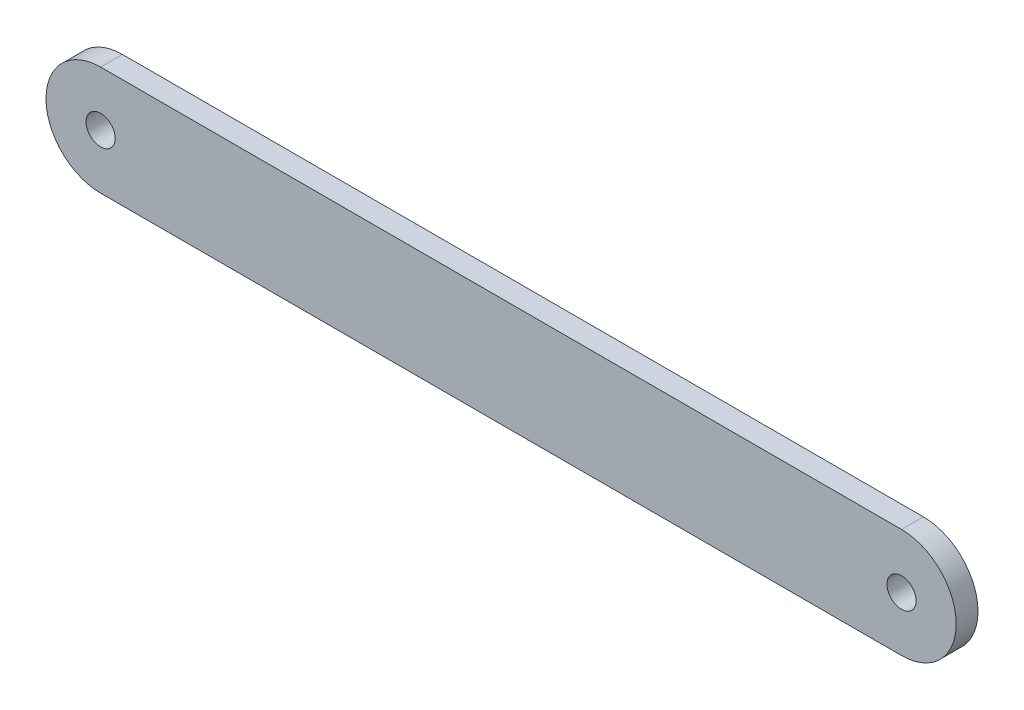
ISO-10303-21;
HEADER;
FILE_DESCRIPTION(('STEP AP214'),'2;1');
FILE_NAME('part.step','',(''),(''),'','','');
FILE_SCHEMA(('AUTOMOTIVE_DESIGN { 1 0 10303 214 1 1 1 1 }'));
ENDSEC;
DATA;
#1=APPLICATION_CONTEXT('core data for automotive mechanical design processes');
#2=APPLICATION_PROTOCOL_DEFINITION('international standard','automotive_design',2000,#1);
#3=PRODUCT_CONTEXT('',#1,'mechanical');
#4=PRODUCT('Part','Part','',(#3));
#5=PRODUCT_RELATED_PRODUCT_CATEGORY('part','',(#4));
#6=PRODUCT_DEFINITION_FORMATION('','',#4);
#7=PRODUCT_DEFINITION_CONTEXT('part definition',#1,'design');
#8=PRODUCT_DEFINITION('design','',#6,#7);
#9=PRODUCT_DEFINITION_SHAPE('','',#8);
#10=(LENGTH_UNIT() NAMED_UNIT(*) SI_UNIT(.MILLI.,.METRE.));
#11=(NAMED_UNIT(*) PLANE_ANGLE_UNIT() SI_UNIT($,.RADIAN.));
#12=(NAMED_UNIT(*) SI_UNIT($,.STERADIAN.) SOLID_ANGLE_UNIT());
#13=UNCERTAINTY_MEASURE_WITH_UNIT(LENGTH_MEASURE(1.E-05),#10,'distance_accuracy_value','');
#14=(GEOMETRIC_REPRESENTATION_CONTEXT(3) GLOBAL_UNCERTAINTY_ASSIGNED_CONTEXT((#13)) GLOBAL_UNIT_ASSIGNED_CONTEXT((#10,
#11,#12)) REPRESENTATION_CONTEXT('',''));
#15=CARTESIAN_POINT('',(0.,0.,0.));
#16=DIRECTION('',(0.,0.,1.));
#17=DIRECTION('',(1.,0.,0.));
#18=AXIS2_PLACEMENT_3D('',#15,#16,#17);
#19=CARTESIAN_POINT('',(0.,0.,3.));
#20=DIRECTION('',(0.,0.,1.));
#21=DIRECTION('',(1.,0.,0.));
#22=AXIS2_PLACEMENT_3D('',#19,#20,#21);
#23=PLANE('',#22);
#24=CARTESIAN_POINT('',(0.,0.,3.));
#25=DIRECTION('',(0.,0.,1.));
#26=DIRECTION('',(1.,0.,0.));
#27=AXIS2_PLACEMENT_3D('',#24,#25,#26);
#28=CIRCLE('',#27,2.);
#29=CARTESIAN_POINT('',(2.,0.,3.));
#30=VERTEX_POINT('',#29);
#31=EDGE_CURVE('E100',#30,#30,#28,.T.);
#32=ORIENTED_EDGE('',*,*,#31,.F.);
#33=EDGE_LOOP('',(#32));
#34=FACE_BOUND('',#33,.T.);
#35=CARTESIAN_POINT('',(0.,0.,3.));
#36=DIRECTION('',(0.,0.,1.));
#37=DIRECTION('',(1.,0.,0.));
#38=AXIS2_PLACEMENT_3D('',#35,#36,#37);
#39=CIRCLE('',#38,7.5);
#40=CARTESIAN_POINT('',(0.,7.5,3.));
#41=VERTEX_POINT('',#40);
#42=CARTESIAN_POINT('',(0.,-7.5,3.));
#43=VERTEX_POINT('',#42);
#44=EDGE_CURVE('E85',#41,#43,#39,.T.);
#45=ORIENTED_EDGE('',*,*,#44,.T.);
#46=DIRECTION('',(1.,0.,0.));
#47=VECTOR('',#46,1.);
#48=CARTESIAN_POINT('',(0.,-7.5,3.));
#49=LINE('',#48,#47);
#50=CARTESIAN_POINT('',(110.,-7.5,3.));
#51=VERTEX_POINT('',#50);
#52=EDGE_CURVE('E80',#43,#51,#49,.T.);
#53=ORIENTED_EDGE('',*,*,#52,.T.);
#54=CARTESIAN_POINT('',(110.,0.,3.));
#55=DIRECTION('',(0.,0.,1.));
#56=DIRECTION('',(1.,0.,0.));
#57=AXIS2_PLACEMENT_3D('',#54,#55,#56);
#58=CIRCLE('',#57,7.5);
#59=CARTESIAN_POINT('',(110.,7.5,3.));
#60=VERTEX_POINT('',#59);
#61=EDGE_CURVE('E83',#51,#60,#58,.T.);
#62=ORIENTED_EDGE('',*,*,#61,.T.);
#63=DIRECTION('',(-1.,0.,0.));
#64=VECTOR('',#63,1.);
#65=CARTESIAN_POINT('',(0.,7.5,3.));
#66=LINE('',#65,#64);
#67=EDGE_CURVE('E50',#60,#41,#66,.T.);
#68=ORIENTED_EDGE('',*,*,#67,.T.);
#69=EDGE_LOOP('',(#45,#53,#62,#68));
#70=FACE_BOUND('',#69,.T.);
#71=CARTESIAN_POINT('',(110.,0.,3.));
#72=DIRECTION('',(0.,0.,1.));
#73=DIRECTION('',(1.,0.,0.));
#74=AXIS2_PLACEMENT_3D('',#71,#72,#73);
#75=CIRCLE('',#74,2.);
#76=CARTESIAN_POINT('',(112.,0.,3.));
#77=VERTEX_POINT('',#76);
#78=EDGE_CURVE('E115',#77,#77,#75,.T.);
#79=ORIENTED_EDGE('',*,*,#78,.F.);
#80=EDGE_LOOP('',(#79));
#81=FACE_BOUND('',#80,.T.);
#82=ADVANCED_FACE('F33',(#34,#70,#81),#23,.T.);
#83=CARTESIAN_POINT('',(0.,0.,0.));
#84=DIRECTION('',(0.,0.,1.));
#85=DIRECTION('',(1.,0.,0.));
#86=AXIS2_PLACEMENT_3D('',#83,#84,#85);
#87=PLANE('',#86);
#88=CARTESIAN_POINT('',(0.,0.,0.));
#89=DIRECTION('',(0.,0.,1.));
#90=DIRECTION('',(1.,0.,0.));
#91=AXIS2_PLACEMENT_3D('',#88,#89,#90);
#92=CIRCLE('',#91,7.5);
#93=CARTESIAN_POINT('',(0.,7.5,0.));
#94=VERTEX_POINT('',#93);
#95=CARTESIAN_POINT('',(0.,-7.5,0.));
#96=VERTEX_POINT('',#95);
#97=EDGE_CURVE('E97',#94,#96,#92,.T.);
#98=ORIENTED_EDGE('',*,*,#97,.F.);
#99=DIRECTION('',(-1.,0.,0.));
#100=VECTOR('',#99,1.);
#101=CARTESIAN_POINT('',(0.,7.5,0.));
#102=LINE('',#101,#100);
#103=CARTESIAN_POINT('',(110.,7.5,0.));
#104=VERTEX_POINT('',#103);
#105=EDGE_CURVE('E73',#104,#94,#102,.T.);
#106=ORIENTED_EDGE('',*,*,#105,.F.);
#107=CARTESIAN_POINT('',(110.,0.,0.));
#108=DIRECTION('',(0.,0.,1.));
#109=DIRECTION('',(1.,0.,0.));
#110=AXIS2_PLACEMENT_3D('',#107,#108,#109);
#111=CIRCLE('',#110,7.5);
#112=CARTESIAN_POINT('',(110.,-7.5,0.));
#113=VERTEX_POINT('',#112);
#114=EDGE_CURVE('E67',#113,#104,#111,.T.);
#115=ORIENTED_EDGE('',*,*,#114,.F.);
#116=DIRECTION('',(1.,0.,0.));
#117=VECTOR('',#116,1.);
#118=CARTESIAN_POINT('',(0.,-7.5,0.));
#119=LINE('',#118,#117);
#120=EDGE_CURVE('E89',#96,#113,#119,.T.);
#121=ORIENTED_EDGE('',*,*,#120,.F.);
#122=EDGE_LOOP('',(#98,#106,#115,#121));
#123=FACE_BOUND('',#122,.T.);
#124=CARTESIAN_POINT('',(0.,0.,0.));
#125=DIRECTION('',(0.,0.,1.));
#126=DIRECTION('',(1.,0.,0.));
#127=AXIS2_PLACEMENT_3D('',#124,#125,#126);
#128=CIRCLE('',#127,2.);
#129=CARTESIAN_POINT('',(2.,0.,0.));
#130=VERTEX_POINT('',#129);
#131=EDGE_CURVE('E112',#130,#130,#128,.T.);
#132=ORIENTED_EDGE('',*,*,#131,.T.);
#133=EDGE_LOOP('',(#132));
#134=FACE_BOUND('',#133,.T.);
#135=CARTESIAN_POINT('',(110.,0.,0.));
#136=DIRECTION('',(0.,0.,1.));
#137=DIRECTION('',(1.,0.,0.));
#138=AXIS2_PLACEMENT_3D('',#135,#136,#137);
#139=CIRCLE('',#138,2.);
#140=CARTESIAN_POINT('',(112.,0.,0.));
#141=VERTEX_POINT('',#140);
#142=EDGE_CURVE('E118',#141,#141,#139,.T.);
#143=ORIENTED_EDGE('',*,*,#142,.T.);
#144=EDGE_LOOP('',(#143));
#145=FACE_BOUND('',#144,.T.);
#146=ADVANCED_FACE('F108',(#123,#134,#145),#87,.F.);
#147=CARTESIAN_POINT('',(0.,0.,3.));
#148=DIRECTION('',(0.,0.,-1.));
#149=DIRECTION('',(-1.,0.,0.));
#150=AXIS2_PLACEMENT_3D('',#147,#148,#149);
#151=CYLINDRICAL_SURFACE('',#150,7.5);
#152=ORIENTED_EDGE('',*,*,#97,.T.);
#153=DIRECTION('',(0.,0.,-1.));
#154=VECTOR('',#153,1.);
#155=CARTESIAN_POINT('',(0.,-7.5,3.));
#156=LINE('',#155,#154);
#157=EDGE_CURVE('E11',#43,#96,#156,.T.);
#158=ORIENTED_EDGE('',*,*,#157,.F.);
#159=ORIENTED_EDGE('',*,*,#44,.F.);
#160=DIRECTION('',(0.,0.,-1.));
#161=VECTOR('',#160,1.);
#162=CARTESIAN_POINT('',(0.,7.5,3.));
#163=LINE('',#162,#161);
#164=EDGE_CURVE('E93',#41,#94,#163,.T.);
#165=ORIENTED_EDGE('',*,*,#164,.T.);
#166=EDGE_LOOP('',(#152,#158,#159,#165));
#167=FACE_BOUND('',#166,.T.);
#168=ADVANCED_FACE('F35',(#167),#151,.T.);
#169=CARTESIAN_POINT('',(0.,-7.5,3.));
#170=DIRECTION('',(0.,1.,0.));
#171=DIRECTION('',(0.,0.,1.));
#172=AXIS2_PLACEMENT_3D('',#169,#170,#171);
#173=PLANE('',#172);
#174=ORIENTED_EDGE('',*,*,#120,.T.);
#175=DIRECTION('',(0.,0.,-1.));
#176=VECTOR('',#175,1.);
#177=CARTESIAN_POINT('',(110.,-7.5,3.));
#178=LINE('',#177,#176);
#179=EDGE_CURVE('E42',#51,#113,#178,.T.);
#180=ORIENTED_EDGE('',*,*,#179,.F.);
#181=ORIENTED_EDGE('',*,*,#52,.F.);
#182=ORIENTED_EDGE('',*,*,#157,.T.);
#183=EDGE_LOOP('',(#174,#180,#181,#182));
#184=FACE_BOUND('',#183,.T.);
#185=ADVANCED_FACE('F88',(#184),#173,.F.);
#186=CARTESIAN_POINT('',(110.,0.,3.));
#187=DIRECTION('',(0.,0.,-1.));
#188=DIRECTION('',(-1.,0.,0.));
#189=AXIS2_PLACEMENT_3D('',#186,#187,#188);
#190=CYLINDRICAL_SURFACE('',#189,7.5);
#191=ORIENTED_EDGE('',*,*,#114,.T.);
#192=DIRECTION('',(0.,0.,-1.));
#193=VECTOR('',#192,1.);
#194=CARTESIAN_POINT('',(110.,7.5,3.));
#195=LINE('',#194,#193);
#196=EDGE_CURVE('E90',#60,#104,#195,.T.);
#197=ORIENTED_EDGE('',*,*,#196,.F.);
#198=ORIENTED_EDGE('',*,*,#61,.F.);
#199=ORIENTED_EDGE('',*,*,#179,.T.);
#200=EDGE_LOOP('',(#191,#197,#198,#199));
#201=FACE_BOUND('',#200,.T.);
#202=ADVANCED_FACE('F91',(#201),#190,.T.);
#203=CARTESIAN_POINT('',(0.,7.5,3.));
#204=DIRECTION('',(0.,-1.,0.));
#205=DIRECTION('',(0.,0.,-1.));
#206=AXIS2_PLACEMENT_3D('',#203,#204,#205);
#207=PLANE('',#206);
#208=ORIENTED_EDGE('',*,*,#105,.T.);
#209=ORIENTED_EDGE('',*,*,#164,.F.);
#210=ORIENTED_EDGE('',*,*,#67,.F.);
#211=ORIENTED_EDGE('',*,*,#196,.T.);
#212=EDGE_LOOP('',(#208,#209,#210,#211));
#213=FACE_BOUND('',#212,.T.);
#214=ADVANCED_FACE('F105',(#213),#207,.F.);
#215=CARTESIAN_POINT('',(0.,0.,3.));
#216=DIRECTION('',(0.,0.,-1.));
#217=DIRECTION('',(-1.,0.,0.));
#218=AXIS2_PLACEMENT_3D('',#215,#216,#217);
#219=CYLINDRICAL_SURFACE('',#218,2.);
#220=ORIENTED_EDGE('',*,*,#31,.T.);
#221=EDGE_LOOP('',(#220));
#222=FACE_BOUND('',#221,.T.);
#223=ORIENTED_EDGE('',*,*,#131,.F.);
#224=EDGE_LOOP('',(#223));
#225=FACE_BOUND('',#224,.T.);
#226=ADVANCED_FACE('F135',(#222,#225),#219,.F.);
#227=CARTESIAN_POINT('',(110.,0.,3.));
#228=DIRECTION('',(0.,0.,-1.));
#229=DIRECTION('',(-1.,0.,0.));
#230=AXIS2_PLACEMENT_3D('',#227,#228,#229);
#231=CYLINDRICAL_SURFACE('',#230,2.);
#232=ORIENTED_EDGE('',*,*,#78,.T.);
#233=EDGE_LOOP('',(#232));
#234=FACE_BOUND('',#233,.T.);
#235=ORIENTED_EDGE('',*,*,#142,.F.);
#236=EDGE_LOOP('',(#235));
#237=FACE_BOUND('',#236,.T.);
#238=ADVANCED_FACE('F124',(#234,#237),#231,.F.);
#239=CLOSED_SHELL('',(#82,#146,#168,#185,#202,#214,#226,#238));
#240=MANIFOLD_SOLID_BREP('B2',#239);
#241=ADVANCED_BREP_SHAPE_REPRESENTATION('',(#18,#240),#14);
#242=SHAPE_DEFINITION_REPRESENTATION(#9,#241);
ENDSEC;
END-ISO-10303-21;
